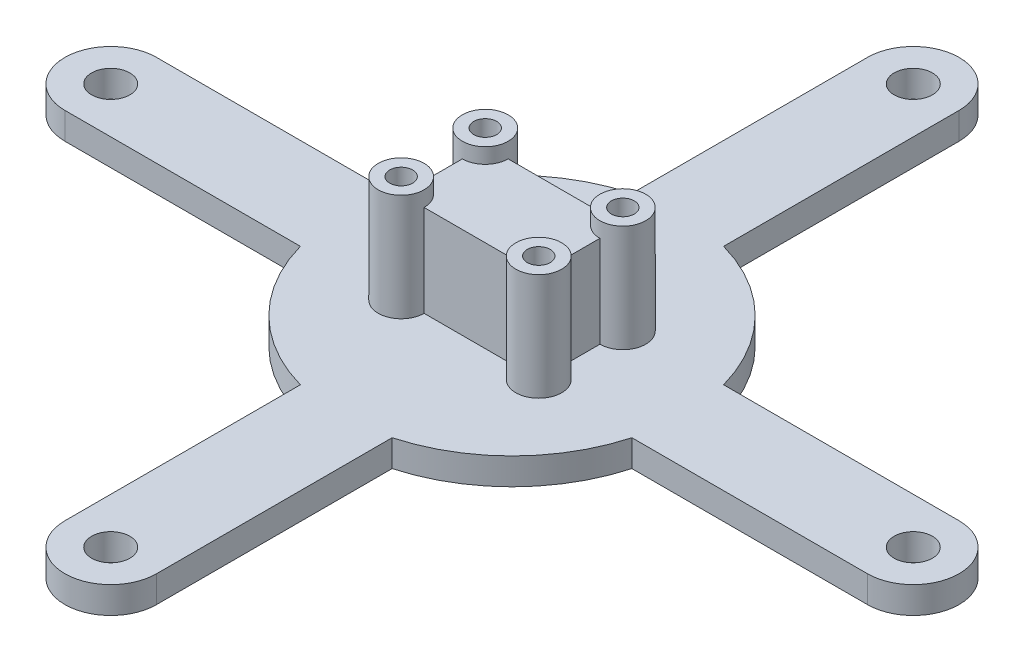
ISO-10303-21;
HEADER;
FILE_DESCRIPTION(('STEP AP214'),'2;1');
FILE_NAME('part.step','',(''),(''),'','','');
FILE_SCHEMA(('AUTOMOTIVE_DESIGN { 1 0 10303 214 1 1 1 1 }'));
ENDSEC;
DATA;
#1=APPLICATION_CONTEXT('core data for automotive mechanical design processes');
#2=APPLICATION_PROTOCOL_DEFINITION('international standard','automotive_design',2000,#1);
#3=PRODUCT_CONTEXT('',#1,'mechanical');
#4=PRODUCT('Part','Part','',(#3));
#5=PRODUCT_RELATED_PRODUCT_CATEGORY('part','',(#4));
#6=PRODUCT_DEFINITION_FORMATION('','',#4);
#7=PRODUCT_DEFINITION_CONTEXT('part definition',#1,'design');
#8=PRODUCT_DEFINITION('design','',#6,#7);
#9=PRODUCT_DEFINITION_SHAPE('','',#8);
#10=(LENGTH_UNIT() NAMED_UNIT(*) SI_UNIT(.MILLI.,.METRE.));
#11=(NAMED_UNIT(*) PLANE_ANGLE_UNIT() SI_UNIT($,.RADIAN.));
#12=(NAMED_UNIT(*) SI_UNIT($,.STERADIAN.) SOLID_ANGLE_UNIT());
#13=UNCERTAINTY_MEASURE_WITH_UNIT(LENGTH_MEASURE(1.E-05),#10,'distance_accuracy_value','');
#14=(GEOMETRIC_REPRESENTATION_CONTEXT(3) GLOBAL_UNCERTAINTY_ASSIGNED_CONTEXT((#13)) GLOBAL_UNIT_ASSIGNED_CONTEXT((#10,
#11,#12)) REPRESENTATION_CONTEXT('',''));
#15=CARTESIAN_POINT('',(0.,0.,0.));
#16=DIRECTION('',(0.,0.,1.));
#17=DIRECTION('',(1.,0.,0.));
#18=AXIS2_PLACEMENT_3D('',#15,#16,#17);
#19=CARTESIAN_POINT('',(9.,17.5,-5.5));
#20=DIRECTION('',(0.,1.,0.));
#21=DIRECTION('',(0.,0.,1.));
#22=AXIS2_PLACEMENT_3D('',#19,#20,#21);
#23=PLANE('',#22);
#24=CARTESIAN_POINT('',(-9.,17.5,-5.5));
#25=DIRECTION('',(0.,1.,0.));
#26=DIRECTION('',(0.,0.,1.));
#27=AXIS2_PLACEMENT_3D('',#24,#25,#26);
#28=CIRCLE('',#27,1.5);
#29=CARTESIAN_POINT('',(-9.,17.5,-4.));
#30=VERTEX_POINT('',#29);
#31=EDGE_CURVE('E448',#30,#30,#28,.T.);
#32=ORIENTED_EDGE('',*,*,#31,.F.);
#33=EDGE_LOOP('',(#32));
#34=FACE_BOUND('',#33,.T.);
#35=CARTESIAN_POINT('',(-9.,17.5,-5.5));
#36=DIRECTION('',(0.,1.,0.));
#37=DIRECTION('',(0.,0.,1.));
#38=AXIS2_PLACEMENT_3D('',#35,#36,#37);
#39=CIRCLE('',#38,3.);
#40=CARTESIAN_POINT('',(-9.,17.5,-2.5));
#41=VERTEX_POINT('',#40);
#42=EDGE_CURVE('E434',#41,#41,#39,.T.);
#43=ORIENTED_EDGE('',*,*,#42,.T.);
#44=EDGE_LOOP('',(#43));
#45=FACE_BOUND('',#44,.T.);
#46=ADVANCED_FACE('F36',(#34,#45),#23,.T.);
#47=CARTESIAN_POINT('',(9.,17.5,-5.5));
#48=DIRECTION('',(0.,1.,0.));
#49=DIRECTION('',(0.,0.,1.));
#50=AXIS2_PLACEMENT_3D('',#47,#48,#49);
#51=CIRCLE('',#50,1.5);
#52=CARTESIAN_POINT('',(9.,17.5,-4.));
#53=VERTEX_POINT('',#52);
#54=EDGE_CURVE('E496',#53,#53,#51,.T.);
#55=ORIENTED_EDGE('',*,*,#54,.F.);
#56=EDGE_LOOP('',(#55));
#57=FACE_BOUND('',#56,.T.);
#58=CARTESIAN_POINT('',(9.,17.5,-5.5));
#59=DIRECTION('',(0.,1.,0.));
#60=DIRECTION('',(0.,0.,1.));
#61=AXIS2_PLACEMENT_3D('',#58,#59,#60);
#62=CIRCLE('',#61,3.);
#63=CARTESIAN_POINT('',(9.,17.5,-2.5));
#64=VERTEX_POINT('',#63);
#65=EDGE_CURVE('E440',#64,#64,#62,.T.);
#66=ORIENTED_EDGE('',*,*,#65,.T.);
#67=EDGE_LOOP('',(#66));
#68=FACE_BOUND('',#67,.T.);
#69=ADVANCED_FACE('F403',(#57,#68),#23,.T.);
#70=CARTESIAN_POINT('',(9.,17.5,5.5));
#71=DIRECTION('',(0.,1.,0.));
#72=DIRECTION('',(0.,0.,1.));
#73=AXIS2_PLACEMENT_3D('',#70,#71,#72);
#74=CIRCLE('',#73,1.5);
#75=CARTESIAN_POINT('',(9.,17.5,7.));
#76=VERTEX_POINT('',#75);
#77=EDGE_CURVE('E499',#76,#76,#74,.T.);
#78=ORIENTED_EDGE('',*,*,#77,.F.);
#79=EDGE_LOOP('',(#78));
#80=FACE_BOUND('',#79,.T.);
#81=CARTESIAN_POINT('',(9.,17.5,5.5));
#82=DIRECTION('',(0.,1.,0.));
#83=DIRECTION('',(0.,0.,1.));
#84=AXIS2_PLACEMENT_3D('',#81,#82,#83);
#85=CIRCLE('',#84,3.);
#86=CARTESIAN_POINT('',(9.,17.5,8.5));
#87=VERTEX_POINT('',#86);
#88=EDGE_CURVE('E433',#87,#87,#85,.T.);
#89=ORIENTED_EDGE('',*,*,#88,.T.);
#90=EDGE_LOOP('',(#89));
#91=FACE_BOUND('',#90,.T.);
#92=ADVANCED_FACE('F410',(#80,#91),#23,.T.);
#93=CARTESIAN_POINT('',(-9.,17.5,5.5));
#94=DIRECTION('',(0.,1.,0.));
#95=DIRECTION('',(0.,0.,1.));
#96=AXIS2_PLACEMENT_3D('',#93,#94,#95);
#97=CIRCLE('',#96,1.5);
#98=CARTESIAN_POINT('',(-9.,17.5,7.));
#99=VERTEX_POINT('',#98);
#100=EDGE_CURVE('E428',#99,#99,#97,.T.);
#101=ORIENTED_EDGE('',*,*,#100,.F.);
#102=EDGE_LOOP('',(#101));
#103=FACE_BOUND('',#102,.T.);
#104=CARTESIAN_POINT('',(-9.,17.5,5.5));
#105=DIRECTION('',(0.,1.,0.));
#106=DIRECTION('',(0.,0.,1.));
#107=AXIS2_PLACEMENT_3D('',#104,#105,#106);
#108=CIRCLE('',#107,3.);
#109=CARTESIAN_POINT('',(-9.,17.5,8.5));
#110=VERTEX_POINT('',#109);
#111=EDGE_CURVE('E431',#110,#110,#108,.T.);
#112=ORIENTED_EDGE('',*,*,#111,.T.);
#113=EDGE_LOOP('',(#112));
#114=FACE_BOUND('',#113,.T.);
#115=ADVANCED_FACE('F406',(#103,#114),#23,.T.);
#116=CARTESIAN_POINT('',(5.99999999999999,17.5,-5.5));
#117=DIRECTION('',(0.,0.,1.));
#118=DIRECTION('',(1.,0.,0.));
#119=AXIS2_PLACEMENT_3D('',#116,#117,#118);
#120=PLANE('',#119);
#121=DIRECTION('',(-1.,0.,0.));
#122=VECTOR('',#121,1.);
#123=CARTESIAN_POINT('',(0.,15.5,-5.5));
#124=LINE('',#123,#122);
#125=CARTESIAN_POINT('',(5.99999999999999,15.5,-5.5));
#126=VERTEX_POINT('',#125);
#127=CARTESIAN_POINT('',(-6.,15.5,-5.5));
#128=VERTEX_POINT('',#127);
#129=EDGE_CURVE('E206',#126,#128,#124,.T.);
#130=ORIENTED_EDGE('',*,*,#129,.F.);
#131=DIRECTION('',(0.,-1.,0.));
#132=VECTOR('',#131,1.);
#133=CARTESIAN_POINT('',(5.99999999999999,17.5,-5.5));
#134=LINE('',#133,#132);
#135=CARTESIAN_POINT('',(5.99999999999999,3.5,-5.5));
#136=VERTEX_POINT('',#135);
#137=EDGE_CURVE('E226',#126,#136,#134,.T.);
#138=ORIENTED_EDGE('',*,*,#137,.T.);
#139=DIRECTION('',(-1.,0.,0.));
#140=VECTOR('',#139,1.);
#141=CARTESIAN_POINT('',(5.99999999999999,3.5,-5.5));
#142=LINE('',#141,#140);
#143=CARTESIAN_POINT('',(-6.,3.5,-5.5));
#144=VERTEX_POINT('',#143);
#145=EDGE_CURVE('E447',#136,#144,#142,.T.);
#146=ORIENTED_EDGE('',*,*,#145,.T.);
#147=DIRECTION('',(0.,-1.,0.));
#148=VECTOR('',#147,1.);
#149=CARTESIAN_POINT('',(-6.,17.5,-5.5));
#150=LINE('',#149,#148);
#151=EDGE_CURVE('E224',#128,#144,#150,.T.);
#152=ORIENTED_EDGE('',*,*,#151,.F.);
#153=EDGE_LOOP('',(#130,#138,#146,#152));
#154=FACE_BOUND('',#153,.T.);
#155=ADVANCED_FACE('F416',(#154),#120,.F.);
#156=CARTESIAN_POINT('',(-9.,17.5,-2.5));
#157=DIRECTION('',(1.,0.,0.));
#158=DIRECTION('',(0.,0.,-1.));
#159=AXIS2_PLACEMENT_3D('',#156,#157,#158);
#160=PLANE('',#159);
#161=DIRECTION('',(0.,0.,1.));
#162=VECTOR('',#161,1.);
#163=CARTESIAN_POINT('',(-9.,15.5,0.));
#164=LINE('',#163,#162);
#165=CARTESIAN_POINT('',(-9.,15.5,-2.5));
#166=VERTEX_POINT('',#165);
#167=CARTESIAN_POINT('',(-9.,15.5,2.5));
#168=VERTEX_POINT('',#167);
#169=EDGE_CURVE('E203',#166,#168,#164,.T.);
#170=ORIENTED_EDGE('',*,*,#169,.F.);
#171=DIRECTION('',(0.,-1.,0.));
#172=VECTOR('',#171,1.);
#173=CARTESIAN_POINT('',(-9.,17.5,-2.5));
#174=LINE('',#173,#172);
#175=CARTESIAN_POINT('',(-9.,3.5,-2.5));
#176=VERTEX_POINT('',#175);
#177=EDGE_CURVE('E214',#166,#176,#174,.T.);
#178=ORIENTED_EDGE('',*,*,#177,.T.);
#179=DIRECTION('',(0.,0.,1.));
#180=VECTOR('',#179,1.);
#181=CARTESIAN_POINT('',(-9.,3.5,-2.5));
#182=LINE('',#181,#180);
#183=CARTESIAN_POINT('',(-9.,3.5,2.5));
#184=VERTEX_POINT('',#183);
#185=EDGE_CURVE('E452',#176,#184,#182,.T.);
#186=ORIENTED_EDGE('',*,*,#185,.T.);
#187=DIRECTION('',(0.,-1.,0.));
#188=VECTOR('',#187,1.);
#189=CARTESIAN_POINT('',(-9.,17.5,2.5));
#190=LINE('',#189,#188);
#191=EDGE_CURVE('E216',#168,#184,#190,.T.);
#192=ORIENTED_EDGE('',*,*,#191,.F.);
#193=EDGE_LOOP('',(#170,#178,#186,#192));
#194=FACE_BOUND('',#193,.T.);
#195=ADVANCED_FACE('F212',(#194),#160,.F.);
#196=CARTESIAN_POINT('',(-6.,17.5,5.5));
#197=DIRECTION('',(0.,0.,-1.));
#198=DIRECTION('',(-1.,0.,0.));
#199=AXIS2_PLACEMENT_3D('',#196,#197,#198);
#200=PLANE('',#199);
#201=DIRECTION('',(1.,0.,0.));
#202=VECTOR('',#201,1.);
#203=CARTESIAN_POINT('',(0.,15.5,5.5));
#204=LINE('',#203,#202);
#205=CARTESIAN_POINT('',(-6.,15.5,5.5));
#206=VERTEX_POINT('',#205);
#207=CARTESIAN_POINT('',(6.,15.5,5.5));
#208=VERTEX_POINT('',#207);
#209=EDGE_CURVE('E474',#206,#208,#204,.T.);
#210=ORIENTED_EDGE('',*,*,#209,.F.);
#211=DIRECTION('',(0.,-1.,0.));
#212=VECTOR('',#211,1.);
#213=CARTESIAN_POINT('',(-6.,17.5,5.5));
#214=LINE('',#213,#212);
#215=CARTESIAN_POINT('',(-6.,3.5,5.5));
#216=VERTEX_POINT('',#215);
#217=EDGE_CURVE('E228',#206,#216,#214,.T.);
#218=ORIENTED_EDGE('',*,*,#217,.T.);
#219=DIRECTION('',(1.,0.,0.));
#220=VECTOR('',#219,1.);
#221=CARTESIAN_POINT('',(-6.,3.5,5.5));
#222=LINE('',#221,#220);
#223=CARTESIAN_POINT('',(6.,3.5,5.5));
#224=VERTEX_POINT('',#223);
#225=EDGE_CURVE('E457',#216,#224,#222,.T.);
#226=ORIENTED_EDGE('',*,*,#225,.T.);
#227=DIRECTION('',(0.,-1.,0.));
#228=VECTOR('',#227,1.);
#229=CARTESIAN_POINT('',(6.,17.5,5.5));
#230=LINE('',#229,#228);
#231=EDGE_CURVE('E466',#208,#224,#230,.T.);
#232=ORIENTED_EDGE('',*,*,#231,.F.);
#233=EDGE_LOOP('',(#210,#218,#226,#232));
#234=FACE_BOUND('',#233,.T.);
#235=ADVANCED_FACE('F470',(#234),#200,.F.);
#236=CARTESIAN_POINT('',(9.,17.5,2.5));
#237=DIRECTION('',(-1.,0.,0.));
#238=DIRECTION('',(0.,0.,1.));
#239=AXIS2_PLACEMENT_3D('',#236,#237,#238);
#240=PLANE('',#239);
#241=DIRECTION('',(0.,0.,-1.));
#242=VECTOR('',#241,1.);
#243=CARTESIAN_POINT('',(9.,15.5,0.));
#244=LINE('',#243,#242);
#245=CARTESIAN_POINT('',(9.,15.5,2.5));
#246=VERTEX_POINT('',#245);
#247=CARTESIAN_POINT('',(9.,15.5,-2.5));
#248=VERTEX_POINT('',#247);
#249=EDGE_CURVE('E486',#246,#248,#244,.T.);
#250=ORIENTED_EDGE('',*,*,#249,.F.);
#251=DIRECTION('',(0.,-1.,0.));
#252=VECTOR('',#251,1.);
#253=CARTESIAN_POINT('',(9.,17.5,2.5));
#254=LINE('',#253,#252);
#255=CARTESIAN_POINT('',(9.,3.5,2.5));
#256=VERTEX_POINT('',#255);
#257=EDGE_CURVE('E60',#246,#256,#254,.T.);
#258=ORIENTED_EDGE('',*,*,#257,.T.);
#259=DIRECTION('',(0.,0.,-1.));
#260=VECTOR('',#259,1.);
#261=CARTESIAN_POINT('',(9.,3.5,2.5));
#262=LINE('',#261,#260);
#263=CARTESIAN_POINT('',(9.,3.5,-2.5));
#264=VERTEX_POINT('',#263);
#265=EDGE_CURVE('E462',#256,#264,#262,.T.);
#266=ORIENTED_EDGE('',*,*,#265,.T.);
#267=DIRECTION('',(0.,-1.,0.));
#268=VECTOR('',#267,1.);
#269=CARTESIAN_POINT('',(9.,17.5,-2.5));
#270=LINE('',#269,#268);
#271=EDGE_CURVE('E437',#248,#264,#270,.T.);
#272=ORIENTED_EDGE('',*,*,#271,.F.);
#273=EDGE_LOOP('',(#250,#258,#266,#272));
#274=FACE_BOUND('',#273,.T.);
#275=ADVANCED_FACE('F597',(#274),#240,.F.);
#276=CARTESIAN_POINT('',(0.,3.5,6.));
#277=DIRECTION('',(0.,0.,-1.));
#278=DIRECTION('',(-1.,0.,0.));
#279=AXIS2_PLACEMENT_3D('',#276,#277,#278);
#280=PLANE('',#279);
#281=DIRECTION('',(1.,0.,0.));
#282=VECTOR('',#281,1.);
#283=CARTESIAN_POINT('',(0.,0.,6.));
#284=LINE('',#283,#282);
#285=CARTESIAN_POINT('',(21.6852484422014,0.,6.));
#286=VERTEX_POINT('',#285);
#287=CARTESIAN_POINT('',(52.5000000000013,0.,6.));
#288=VERTEX_POINT('',#287);
#289=EDGE_CURVE('E233',#286,#288,#284,.T.);
#290=ORIENTED_EDGE('',*,*,#289,.T.);
#291=DIRECTION('',(0.,-1.,0.));
#292=VECTOR('',#291,1.);
#293=CARTESIAN_POINT('',(52.5000000000013,3.5,6.));
#294=LINE('',#293,#292);
#295=CARTESIAN_POINT('',(52.5000000000013,3.5,6.));
#296=VERTEX_POINT('',#295);
#297=EDGE_CURVE('E12',#296,#288,#294,.T.);
#298=ORIENTED_EDGE('',*,*,#297,.F.);
#299=DIRECTION('',(1.,0.,0.));
#300=VECTOR('',#299,1.);
#301=CARTESIAN_POINT('',(0.,3.5,6.));
#302=LINE('',#301,#300);
#303=CARTESIAN_POINT('',(21.6852484422014,3.5,6.));
#304=VERTEX_POINT('',#303);
#305=EDGE_CURVE('E234',#304,#296,#302,.T.);
#306=ORIENTED_EDGE('',*,*,#305,.F.);
#307=DIRECTION('',(0.,-1.,0.));
#308=VECTOR('',#307,1.);
#309=CARTESIAN_POINT('',(21.6852484422014,3.5,6.));
#310=LINE('',#309,#308);
#311=EDGE_CURVE('E284',#304,#286,#310,.T.);
#312=ORIENTED_EDGE('',*,*,#311,.T.);
#313=EDGE_LOOP('',(#290,#298,#306,#312));
#314=FACE_BOUND('',#313,.T.);
#315=ADVANCED_FACE('F38',(#314),#280,.F.);
#316=CARTESIAN_POINT('',(52.5000000000013,3.5,0.));
#317=DIRECTION('',(0.,-1.,0.));
#318=DIRECTION('',(0.,0.,-1.));
#319=AXIS2_PLACEMENT_3D('',#316,#317,#318);
#320=CYLINDRICAL_SURFACE('',#319,6.00000000000124);
#321=CARTESIAN_POINT('',(52.5000000000013,0.,0.));
#322=DIRECTION('',(0.,1.,0.));
#323=DIRECTION('',(0.,0.,1.));
#324=AXIS2_PLACEMENT_3D('',#321,#322,#323);
#325=CIRCLE('',#324,6.00000000000124);
#326=CARTESIAN_POINT('',(52.5000000000013,0.,-6.));
#327=VERTEX_POINT('',#326);
#328=EDGE_CURVE('E287',#288,#327,#325,.T.);
#329=ORIENTED_EDGE('',*,*,#328,.T.);
#330=DIRECTION('',(0.,-1.,0.));
#331=VECTOR('',#330,1.);
#332=CARTESIAN_POINT('',(52.5000000000013,3.5,-6.));
#333=LINE('',#332,#331);
#334=CARTESIAN_POINT('',(52.5000000000013,3.5,-6.));
#335=VERTEX_POINT('',#334);
#336=EDGE_CURVE('E45',#335,#327,#333,.T.);
#337=ORIENTED_EDGE('',*,*,#336,.F.);
#338=CARTESIAN_POINT('',(52.5000000000013,3.5,0.));
#339=DIRECTION('',(0.,1.,0.));
#340=DIRECTION('',(0.,0.,1.));
#341=AXIS2_PLACEMENT_3D('',#338,#339,#340);
#342=CIRCLE('',#341,6.00000000000124);
#343=EDGE_CURVE('E237',#296,#335,#342,.T.);
#344=ORIENTED_EDGE('',*,*,#343,.F.);
#345=ORIENTED_EDGE('',*,*,#297,.T.);
#346=EDGE_LOOP('',(#329,#337,#344,#345));
#347=FACE_BOUND('',#346,.T.);
#348=ADVANCED_FACE('F590',(#347),#320,.T.);
#349=CARTESIAN_POINT('',(0.,3.5,-6.));
#350=DIRECTION('',(0.,0.,-1.));
#351=DIRECTION('',(-1.,0.,0.));
#352=AXIS2_PLACEMENT_3D('',#349,#350,#351);
#353=PLANE('',#352);
#354=DIRECTION('',(1.,0.,0.));
#355=VECTOR('',#354,1.);
#356=CARTESIAN_POINT('',(0.,0.,-6.));
#357=LINE('',#356,#355);
#358=CARTESIAN_POINT('',(21.6852484422014,0.,-6.));
#359=VERTEX_POINT('',#358);
#360=EDGE_CURVE('E290',#359,#327,#357,.T.);
#361=ORIENTED_EDGE('',*,*,#360,.F.);
#362=DIRECTION('',(0.,-1.,0.));
#363=VECTOR('',#362,1.);
#364=CARTESIAN_POINT('',(21.6852484422014,3.5,-6.));
#365=LINE('',#364,#363);
#366=CARTESIAN_POINT('',(21.6852484422014,3.5,-6.));
#367=VERTEX_POINT('',#366);
#368=EDGE_CURVE('E368',#367,#359,#365,.T.);
#369=ORIENTED_EDGE('',*,*,#368,.F.);
#370=DIRECTION('',(1.,0.,0.));
#371=VECTOR('',#370,1.);
#372=CARTESIAN_POINT('',(0.,3.5,-6.));
#373=LINE('',#372,#371);
#374=EDGE_CURVE('E240',#367,#335,#373,.T.);
#375=ORIENTED_EDGE('',*,*,#374,.T.);
#376=ORIENTED_EDGE('',*,*,#336,.T.);
#377=EDGE_LOOP('',(#361,#369,#375,#376));
#378=FACE_BOUND('',#377,.T.);
#379=ADVANCED_FACE('F587',(#378),#353,.T.);
#380=CARTESIAN_POINT('',(0.,3.5,0.));
#381=DIRECTION('',(0.,-1.,0.));
#382=DIRECTION('',(0.,0.,-1.));
#383=AXIS2_PLACEMENT_3D('',#380,#381,#382);
#384=CYLINDRICAL_SURFACE('',#383,22.5);
#385=CARTESIAN_POINT('',(0.,0.,0.));
#386=DIRECTION('',(0.,1.,0.));
#387=DIRECTION('',(0.,0.,1.));
#388=AXIS2_PLACEMENT_3D('',#385,#386,#387);
#389=CIRCLE('',#388,22.5);
#390=CARTESIAN_POINT('',(6.00000000000052,0.,-21.6852484422013));
#391=VERTEX_POINT('',#390);
#392=EDGE_CURVE('E293',#359,#391,#389,.T.);
#393=ORIENTED_EDGE('',*,*,#392,.T.);
#394=DIRECTION('',(0.,-1.,0.));
#395=VECTOR('',#394,1.);
#396=CARTESIAN_POINT('',(6.00000000000052,3.5,-21.6852484422013));
#397=LINE('',#396,#395);
#398=CARTESIAN_POINT('',(6.00000000000052,3.5,-21.6852484422013));
#399=VERTEX_POINT('',#398);
#400=EDGE_CURVE('E366',#399,#391,#397,.T.);
#401=ORIENTED_EDGE('',*,*,#400,.F.);
#402=CARTESIAN_POINT('',(0.,3.5,0.));
#403=DIRECTION('',(0.,1.,0.));
#404=DIRECTION('',(0.,0.,1.));
#405=AXIS2_PLACEMENT_3D('',#402,#403,#404);
#406=CIRCLE('',#405,22.5);
#407=EDGE_CURVE('E243',#367,#399,#406,.T.);
#408=ORIENTED_EDGE('',*,*,#407,.F.);
#409=ORIENTED_EDGE('',*,*,#368,.T.);
#410=EDGE_LOOP('',(#393,#401,#408,#409));
#411=FACE_BOUND('',#410,.T.);
#412=ADVANCED_FACE('F583',(#411),#384,.T.);
#413=CARTESIAN_POINT('',(6.00000000000075,3.5,0.));
#414=DIRECTION('',(1.,0.,0.));
#415=DIRECTION('',(0.,0.,-1.));
#416=AXIS2_PLACEMENT_3D('',#413,#414,#415);
#417=PLANE('',#416);
#418=DIRECTION('',(0.,0.,1.));
#419=VECTOR('',#418,1.);
#420=CARTESIAN_POINT('',(6.00000000000075,0.,0.));
#421=LINE('',#420,#419);
#422=CARTESIAN_POINT('',(6.00000000000018,0.,-52.5));
#423=VERTEX_POINT('',#422);
#424=EDGE_CURVE('E296',#423,#391,#421,.T.);
#425=ORIENTED_EDGE('',*,*,#424,.F.);
#426=DIRECTION('',(0.,-1.,0.));
#427=VECTOR('',#426,1.);
#428=CARTESIAN_POINT('',(6.00000000000018,3.5,-52.5));
#429=LINE('',#428,#427);
#430=CARTESIAN_POINT('',(6.00000000000018,3.5,-52.5));
#431=VERTEX_POINT('',#430);
#432=EDGE_CURVE('E364',#431,#423,#429,.T.);
#433=ORIENTED_EDGE('',*,*,#432,.F.);
#434=DIRECTION('',(0.,0.,1.));
#435=VECTOR('',#434,1.);
#436=CARTESIAN_POINT('',(6.00000000000075,3.5,0.));
#437=LINE('',#436,#435);
#438=EDGE_CURVE('E245',#431,#399,#437,.T.);
#439=ORIENTED_EDGE('',*,*,#438,.T.);
#440=ORIENTED_EDGE('',*,*,#400,.T.);
#441=EDGE_LOOP('',(#425,#433,#439,#440));
#442=FACE_BOUND('',#441,.T.);
#443=ADVANCED_FACE('F579',(#442),#417,.T.);
#444=CARTESIAN_POINT('',(1.83302770289264E-13,3.5,-52.5));
#445=DIRECTION('',(0.,-1.,0.));
#446=DIRECTION('',(0.,0.,-1.));
#447=AXIS2_PLACEMENT_3D('',#444,#445,#446);
#448=CYLINDRICAL_SURFACE('',#447,5.99999999999993);
#449=CARTESIAN_POINT('',(1.83302770289264E-13,0.,-52.5));
#450=DIRECTION('',(0.,1.,0.));
#451=DIRECTION('',(0.,0.,1.));
#452=AXIS2_PLACEMENT_3D('',#449,#450,#451);
#453=CIRCLE('',#452,5.99999999999993);
#454=CARTESIAN_POINT('',(-5.99999999999981,0.,-52.5));
#455=VERTEX_POINT('',#454);
#456=EDGE_CURVE('E299',#423,#455,#453,.T.);
#457=ORIENTED_EDGE('',*,*,#456,.T.);
#458=DIRECTION('',(0.,-1.,0.));
#459=VECTOR('',#458,1.);
#460=CARTESIAN_POINT('',(-5.99999999999981,3.5,-52.5));
#461=LINE('',#460,#459);
#462=CARTESIAN_POINT('',(-5.99999999999981,3.5,-52.5));
#463=VERTEX_POINT('',#462);
#464=EDGE_CURVE('E361',#463,#455,#461,.T.);
#465=ORIENTED_EDGE('',*,*,#464,.F.);
#466=CARTESIAN_POINT('',(1.83302770289264E-13,3.5,-52.5));
#467=DIRECTION('',(0.,1.,0.));
#468=DIRECTION('',(0.,0.,1.));
#469=AXIS2_PLACEMENT_3D('',#466,#467,#468);
#470=CIRCLE('',#469,5.99999999999993);
#471=EDGE_CURVE('E248',#431,#463,#470,.T.);
#472=ORIENTED_EDGE('',*,*,#471,.F.);
#473=ORIENTED_EDGE('',*,*,#432,.T.);
#474=EDGE_LOOP('',(#457,#465,#472,#473));
#475=FACE_BOUND('',#474,.T.);
#476=ADVANCED_FACE('F575',(#475),#448,.T.);
#477=CARTESIAN_POINT('',(-5.99999999999925,3.5,0.));
#478=DIRECTION('',(1.,0.,0.));
#479=DIRECTION('',(0.,0.,-1.));
#480=AXIS2_PLACEMENT_3D('',#477,#478,#479);
#481=PLANE('',#480);
#482=DIRECTION('',(0.,0.,1.));
#483=VECTOR('',#482,1.);
#484=CARTESIAN_POINT('',(-5.99999999999925,0.,0.));
#485=LINE('',#484,#483);
#486=CARTESIAN_POINT('',(-5.99999999999948,0.,-21.6852484422016));
#487=VERTEX_POINT('',#486);
#488=EDGE_CURVE('E301',#455,#487,#485,.T.);
#489=ORIENTED_EDGE('',*,*,#488,.T.);
#490=DIRECTION('',(0.,-1.,0.));
#491=VECTOR('',#490,1.);
#492=CARTESIAN_POINT('',(-5.99999999999948,3.5,-21.6852484422016));
#493=LINE('',#492,#491);
#494=CARTESIAN_POINT('',(-5.99999999999948,3.5,-21.6852484422016));
#495=VERTEX_POINT('',#494);
#496=EDGE_CURVE('E358',#495,#487,#493,.T.);
#497=ORIENTED_EDGE('',*,*,#496,.F.);
#498=DIRECTION('',(0.,0.,1.));
#499=VECTOR('',#498,1.);
#500=CARTESIAN_POINT('',(-5.99999999999925,3.5,0.));
#501=LINE('',#500,#499);
#502=EDGE_CURVE('E250',#463,#495,#501,.T.);
#503=ORIENTED_EDGE('',*,*,#502,.F.);
#504=ORIENTED_EDGE('',*,*,#464,.T.);
#505=EDGE_LOOP('',(#489,#497,#503,#504));
#506=FACE_BOUND('',#505,.T.);
#507=ADVANCED_FACE('F571',(#506),#481,.F.);
#508=CARTESIAN_POINT('',(0.,3.5,0.));
#509=DIRECTION('',(0.,-1.,0.));
#510=DIRECTION('',(0.,0.,-1.));
#511=AXIS2_PLACEMENT_3D('',#508,#509,#510);
#512=CYLINDRICAL_SURFACE('',#511,22.5);
#513=CARTESIAN_POINT('',(0.,0.,0.));
#514=DIRECTION('',(0.,1.,0.));
#515=DIRECTION('',(0.,0.,1.));
#516=AXIS2_PLACEMENT_3D('',#513,#514,#515);
#517=CIRCLE('',#516,22.5);
#518=CARTESIAN_POINT('',(-21.6852484422014,0.,-6.));
#519=VERTEX_POINT('',#518);
#520=EDGE_CURVE('E303',#487,#519,#517,.T.);
#521=ORIENTED_EDGE('',*,*,#520,.T.);
#522=DIRECTION('',(0.,-1.,0.));
#523=VECTOR('',#522,1.);
#524=CARTESIAN_POINT('',(-21.6852484422014,3.5,-6.));
#525=LINE('',#524,#523);
#526=CARTESIAN_POINT('',(-21.6852484422014,3.5,-6.));
#527=VERTEX_POINT('',#526);
#528=EDGE_CURVE('E356',#527,#519,#525,.T.);
#529=ORIENTED_EDGE('',*,*,#528,.F.);
#530=CARTESIAN_POINT('',(0.,3.5,0.));
#531=DIRECTION('',(0.,1.,0.));
#532=DIRECTION('',(0.,0.,1.));
#533=AXIS2_PLACEMENT_3D('',#530,#531,#532);
#534=CIRCLE('',#533,22.5);
#535=EDGE_CURVE('E252',#495,#527,#534,.T.);
#536=ORIENTED_EDGE('',*,*,#535,.F.);
#537=ORIENTED_EDGE('',*,*,#496,.T.);
#538=EDGE_LOOP('',(#521,#529,#536,#537));
#539=FACE_BOUND('',#538,.T.);
#540=ADVANCED_FACE('F567',(#539),#512,.T.);
#541=CARTESIAN_POINT('',(0.,3.5,-6.));
#542=DIRECTION('',(0.,0.,-1.));
#543=DIRECTION('',(-1.,0.,0.));
#544=AXIS2_PLACEMENT_3D('',#541,#542,#543);
#545=PLANE('',#544);
#546=DIRECTION('',(1.,0.,0.));
#547=VECTOR('',#546,1.);
#548=CARTESIAN_POINT('',(0.,0.,-6.));
#549=LINE('',#548,#547);
#550=CARTESIAN_POINT('',(-52.5,0.,-5.99999999999999));
#551=VERTEX_POINT('',#550);
#552=EDGE_CURVE('E306',#551,#519,#549,.T.);
#553=ORIENTED_EDGE('',*,*,#552,.F.);
#554=DIRECTION('',(0.,-1.,0.));
#555=VECTOR('',#554,1.);
#556=CARTESIAN_POINT('',(-52.5,3.5,-5.99999999999999));
#557=LINE('',#556,#555);
#558=CARTESIAN_POINT('',(-52.5,3.5,-5.99999999999999));
#559=VERTEX_POINT('',#558);
#560=EDGE_CURVE('E354',#559,#551,#557,.T.);
#561=ORIENTED_EDGE('',*,*,#560,.F.);
#562=DIRECTION('',(1.,0.,0.));
#563=VECTOR('',#562,1.);
#564=CARTESIAN_POINT('',(0.,3.5,-6.));
#565=LINE('',#564,#563);
#566=EDGE_CURVE('E254',#559,#527,#565,.T.);
#567=ORIENTED_EDGE('',*,*,#566,.T.);
#568=ORIENTED_EDGE('',*,*,#528,.T.);
#569=EDGE_LOOP('',(#553,#561,#567,#568));
#570=FACE_BOUND('',#569,.T.);
#571=ADVANCED_FACE('F563',(#570),#545,.T.);
#572=CARTESIAN_POINT('',(-52.5,3.5,0.));
#573=DIRECTION('',(0.,-1.,0.));
#574=DIRECTION('',(0.,0.,-1.));
#575=AXIS2_PLACEMENT_3D('',#572,#573,#574);
#576=CYLINDRICAL_SURFACE('',#575,5.99999999999993);
#577=CARTESIAN_POINT('',(-52.5,0.,0.));
#578=DIRECTION('',(0.,1.,0.));
#579=DIRECTION('',(0.,0.,1.));
#580=AXIS2_PLACEMENT_3D('',#577,#578,#579);
#581=CIRCLE('',#580,5.99999999999993);
#582=CARTESIAN_POINT('',(-52.5,0.,5.99999999999999));
#583=VERTEX_POINT('',#582);
#584=EDGE_CURVE('E309',#551,#583,#581,.T.);
#585=ORIENTED_EDGE('',*,*,#584,.T.);
#586=DIRECTION('',(0.,-1.,0.));
#587=VECTOR('',#586,1.);
#588=CARTESIAN_POINT('',(-52.5,3.5,5.99999999999999));
#589=LINE('',#588,#587);
#590=CARTESIAN_POINT('',(-52.5,3.5,5.99999999999999));
#591=VERTEX_POINT('',#590);
#592=EDGE_CURVE('E351',#591,#583,#589,.T.);
#593=ORIENTED_EDGE('',*,*,#592,.F.);
#594=CARTESIAN_POINT('',(-52.5,3.5,0.));
#595=DIRECTION('',(0.,1.,0.));
#596=DIRECTION('',(0.,0.,1.));
#597=AXIS2_PLACEMENT_3D('',#594,#595,#596);
#598=CIRCLE('',#597,5.99999999999993);
#599=EDGE_CURVE('E257',#559,#591,#598,.T.);
#600=ORIENTED_EDGE('',*,*,#599,.F.);
#601=ORIENTED_EDGE('',*,*,#560,.T.);
#602=EDGE_LOOP('',(#585,#593,#600,#601));
#603=FACE_BOUND('',#602,.T.);
#604=ADVANCED_FACE('F559',(#603),#576,.T.);
#605=CARTESIAN_POINT('',(0.,3.5,6.));
#606=DIRECTION('',(0.,0.,-1.));
#607=DIRECTION('',(-1.,0.,0.));
#608=AXIS2_PLACEMENT_3D('',#605,#606,#607);
#609=PLANE('',#608);
#610=DIRECTION('',(1.,0.,0.));
#611=VECTOR('',#610,1.);
#612=CARTESIAN_POINT('',(0.,0.,6.));
#613=LINE('',#612,#611);
#614=CARTESIAN_POINT('',(-21.6852484422014,0.,6.));
#615=VERTEX_POINT('',#614);
#616=EDGE_CURVE('E311',#583,#615,#613,.T.);
#617=ORIENTED_EDGE('',*,*,#616,.T.);
#618=DIRECTION('',(0.,-1.,0.));
#619=VECTOR('',#618,1.);
#620=CARTESIAN_POINT('',(-21.6852484422014,3.5,6.));
#621=LINE('',#620,#619);
#622=CARTESIAN_POINT('',(-21.6852484422014,3.5,6.));
#623=VERTEX_POINT('',#622);
#624=EDGE_CURVE('E348',#623,#615,#621,.T.);
#625=ORIENTED_EDGE('',*,*,#624,.F.);
#626=DIRECTION('',(1.,0.,0.));
#627=VECTOR('',#626,1.);
#628=CARTESIAN_POINT('',(0.,3.5,6.));
#629=LINE('',#628,#627);
#630=EDGE_CURVE('E259',#591,#623,#629,.T.);
#631=ORIENTED_EDGE('',*,*,#630,.F.);
#632=ORIENTED_EDGE('',*,*,#592,.T.);
#633=EDGE_LOOP('',(#617,#625,#631,#632));
#634=FACE_BOUND('',#633,.T.);
#635=ADVANCED_FACE('F555',(#634),#609,.F.);
#636=CARTESIAN_POINT('',(0.,3.5,0.));
#637=DIRECTION('',(0.,-1.,0.));
#638=DIRECTION('',(0.,0.,-1.));
#639=AXIS2_PLACEMENT_3D('',#636,#637,#638);
#640=CYLINDRICAL_SURFACE('',#639,22.5);
#641=CARTESIAN_POINT('',(0.,0.,0.));
#642=DIRECTION('',(0.,1.,0.));
#643=DIRECTION('',(0.,0.,1.));
#644=AXIS2_PLACEMENT_3D('',#641,#642,#643);
#645=CIRCLE('',#644,22.5);
#646=CARTESIAN_POINT('',(-5.99999999999948,0.,21.6852484422016));
#647=VERTEX_POINT('',#646);
#648=EDGE_CURVE('E313',#615,#647,#645,.T.);
#649=ORIENTED_EDGE('',*,*,#648,.T.);
#650=DIRECTION('',(0.,-1.,0.));
#651=VECTOR('',#650,1.);
#652=CARTESIAN_POINT('',(-5.99999999999948,3.5,21.6852484422016));
#653=LINE('',#652,#651);
#654=CARTESIAN_POINT('',(-5.99999999999948,3.5,21.6852484422016));
#655=VERTEX_POINT('',#654);
#656=EDGE_CURVE('E345',#655,#647,#653,.T.);
#657=ORIENTED_EDGE('',*,*,#656,.F.);
#658=CARTESIAN_POINT('',(0.,3.5,0.));
#659=DIRECTION('',(0.,1.,0.));
#660=DIRECTION('',(0.,0.,1.));
#661=AXIS2_PLACEMENT_3D('',#658,#659,#660);
#662=CIRCLE('',#661,22.5);
#663=EDGE_CURVE('E261',#623,#655,#662,.T.);
#664=ORIENTED_EDGE('',*,*,#663,.F.);
#665=ORIENTED_EDGE('',*,*,#624,.T.);
#666=EDGE_LOOP('',(#649,#657,#664,#665));
#667=FACE_BOUND('',#666,.T.);
#668=ADVANCED_FACE('F551',(#667),#640,.T.);
#669=CARTESIAN_POINT('',(-5.99999999999958,3.5,0.));
#670=DIRECTION('',(1.,0.,0.));
#671=DIRECTION('',(0.,0.,-1.));
#672=AXIS2_PLACEMENT_3D('',#669,#670,#671);
#673=PLANE('',#672);
#674=DIRECTION('',(0.,0.,1.));
#675=VECTOR('',#674,1.);
#676=CARTESIAN_POINT('',(-5.99999999999958,0.,0.));
#677=LINE('',#676,#675);
#678=CARTESIAN_POINT('',(-5.99999999999935,0.,52.5000000000006));
#679=VERTEX_POINT('',#678);
#680=EDGE_CURVE('E315',#647,#679,#677,.T.);
#681=ORIENTED_EDGE('',*,*,#680,.T.);
#682=DIRECTION('',(0.,-1.,0.));
#683=VECTOR('',#682,1.);
#684=CARTESIAN_POINT('',(-5.99999999999935,3.5,52.5000000000006));
#685=LINE('',#684,#683);
#686=CARTESIAN_POINT('',(-5.99999999999935,3.5,52.5000000000006));
#687=VERTEX_POINT('',#686);
#688=EDGE_CURVE('E342',#687,#679,#685,.T.);
#689=ORIENTED_EDGE('',*,*,#688,.F.);
#690=DIRECTION('',(0.,0.,1.));
#691=VECTOR('',#690,1.);
#692=CARTESIAN_POINT('',(-5.99999999999958,3.5,0.));
#693=LINE('',#692,#691);
#694=EDGE_CURVE('E263',#655,#687,#693,.T.);
#695=ORIENTED_EDGE('',*,*,#694,.F.);
#696=ORIENTED_EDGE('',*,*,#656,.T.);
#697=EDGE_LOOP('',(#681,#689,#695,#696));
#698=FACE_BOUND('',#697,.T.);
#699=ADVANCED_FACE('F547',(#698),#673,.F.);
#700=CARTESIAN_POINT('',(6.52256026967279E-13,3.5,52.5000000000006));
#701=DIRECTION('',(0.,-1.,0.));
#702=DIRECTION('',(0.,0.,-1.));
#703=AXIS2_PLACEMENT_3D('',#700,#701,#702);
#704=CYLINDRICAL_SURFACE('',#703,5.99999999999998);
#705=CARTESIAN_POINT('',(6.52256026967279E-13,0.,52.5000000000006));
#706=DIRECTION('',(0.,1.,0.));
#707=DIRECTION('',(0.,0.,1.));
#708=AXIS2_PLACEMENT_3D('',#705,#706,#707);
#709=CIRCLE('',#708,5.99999999999998);
#710=CARTESIAN_POINT('',(6.00000000000064,0.,52.5000000000006));
#711=VERTEX_POINT('',#710);
#712=EDGE_CURVE('E317',#679,#711,#709,.T.);
#713=ORIENTED_EDGE('',*,*,#712,.T.);
#714=DIRECTION('',(0.,-1.,0.));
#715=VECTOR('',#714,1.);
#716=CARTESIAN_POINT('',(6.00000000000064,3.5,52.5000000000006));
#717=LINE('',#716,#715);
#718=CARTESIAN_POINT('',(6.00000000000064,3.5,52.5000000000006));
#719=VERTEX_POINT('',#718);
#720=EDGE_CURVE('E340',#719,#711,#717,.T.);
#721=ORIENTED_EDGE('',*,*,#720,.F.);
#722=CARTESIAN_POINT('',(6.52256026967279E-13,3.5,52.5000000000006));
#723=DIRECTION('',(0.,1.,0.));
#724=DIRECTION('',(0.,0.,1.));
#725=AXIS2_PLACEMENT_3D('',#722,#723,#724);
#726=CIRCLE('',#725,5.99999999999998);
#727=EDGE_CURVE('E265',#687,#719,#726,.T.);
#728=ORIENTED_EDGE('',*,*,#727,.F.);
#729=ORIENTED_EDGE('',*,*,#688,.T.);
#730=EDGE_LOOP('',(#713,#721,#728,#729));
#731=FACE_BOUND('',#730,.T.);
#732=ADVANCED_FACE('F543',(#731),#704,.T.);
#733=CARTESIAN_POINT('',(6.00000000000043,3.5,0.));
#734=DIRECTION('',(1.,0.,0.));
#735=DIRECTION('',(0.,0.,-1.));
#736=AXIS2_PLACEMENT_3D('',#733,#734,#735);
#737=PLANE('',#736);
#738=DIRECTION('',(0.,0.,1.));
#739=VECTOR('',#738,1.);
#740=CARTESIAN_POINT('',(6.00000000000043,0.,0.));
#741=LINE('',#740,#739);
#742=CARTESIAN_POINT('',(6.00000000000052,0.,21.6852484422013));
#743=VERTEX_POINT('',#742);
#744=EDGE_CURVE('E320',#743,#711,#741,.T.);
#745=ORIENTED_EDGE('',*,*,#744,.F.);
#746=DIRECTION('',(0.,-1.,0.));
#747=VECTOR('',#746,1.);
#748=CARTESIAN_POINT('',(6.00000000000052,3.5,21.6852484422013));
#749=LINE('',#748,#747);
#750=CARTESIAN_POINT('',(6.00000000000052,3.5,21.6852484422013));
#751=VERTEX_POINT('',#750);
#752=EDGE_CURVE('E338',#751,#743,#749,.T.);
#753=ORIENTED_EDGE('',*,*,#752,.F.);
#754=DIRECTION('',(0.,0.,1.));
#755=VECTOR('',#754,1.);
#756=CARTESIAN_POINT('',(6.00000000000043,3.5,0.));
#757=LINE('',#756,#755);
#758=EDGE_CURVE('E267',#751,#719,#757,.T.);
#759=ORIENTED_EDGE('',*,*,#758,.T.);
#760=ORIENTED_EDGE('',*,*,#720,.T.);
#761=EDGE_LOOP('',(#745,#753,#759,#760));
#762=FACE_BOUND('',#761,.T.);
#763=ADVANCED_FACE('F529',(#762),#737,.T.);
#764=CARTESIAN_POINT('',(52.5,3.5,3.66605540578529E-13));
#765=DIRECTION('',(0.,-1.,0.));
#766=DIRECTION('',(0.,0.,-1.));
#767=AXIS2_PLACEMENT_3D('',#764,#765,#766);
#768=CYLINDRICAL_SURFACE('',#767,2.5);
#769=CARTESIAN_POINT('',(52.5,3.5,3.66605540578529E-13));
#770=DIRECTION('',(0.,1.,0.));
#771=DIRECTION('',(0.,0.,1.));
#772=AXIS2_PLACEMENT_3D('',#769,#770,#771);
#773=CIRCLE('',#772,2.5);
#774=CARTESIAN_POINT('',(52.5,3.5,2.50000000000037));
#775=VERTEX_POINT('',#774);
#776=EDGE_CURVE('E278',#775,#775,#773,.T.);
#777=ORIENTED_EDGE('',*,*,#776,.T.);
#778=EDGE_LOOP('',(#777));
#779=FACE_BOUND('',#778,.T.);
#780=CARTESIAN_POINT('',(52.5,0.,3.66605540578529E-13));
#781=DIRECTION('',(0.,1.,0.));
#782=DIRECTION('',(0.,0.,1.));
#783=AXIS2_PLACEMENT_3D('',#780,#781,#782);
#784=CIRCLE('',#783,2.5);
#785=CARTESIAN_POINT('',(52.5,0.,2.50000000000037));
#786=VERTEX_POINT('',#785);
#787=EDGE_CURVE('E331',#786,#786,#784,.T.);
#788=ORIENTED_EDGE('',*,*,#787,.F.);
#789=EDGE_LOOP('',(#788));
#790=FACE_BOUND('',#789,.T.);
#791=ADVANCED_FACE('F525',(#779,#790),#768,.F.);
#792=CARTESIAN_POINT('',(1.83302770289264E-13,3.5,-52.5));
#793=DIRECTION('',(0.,-1.,0.));
#794=DIRECTION('',(0.,0.,-1.));
#795=AXIS2_PLACEMENT_3D('',#792,#793,#794);
#796=CYLINDRICAL_SURFACE('',#795,2.5);
#797=CARTESIAN_POINT('',(1.83302770289264E-13,3.5,-52.5));
#798=DIRECTION('',(0.,1.,0.));
#799=DIRECTION('',(0.,0.,1.));
#800=AXIS2_PLACEMENT_3D('',#797,#798,#799);
#801=CIRCLE('',#800,2.5);
#802=CARTESIAN_POINT('',(1.83302770289264E-13,3.5,-50.));
#803=VERTEX_POINT('',#802);
#804=EDGE_CURVE('E275',#803,#803,#801,.T.);
#805=ORIENTED_EDGE('',*,*,#804,.T.);
#806=EDGE_LOOP('',(#805));
#807=FACE_BOUND('',#806,.T.);
#808=CARTESIAN_POINT('',(1.83302770289264E-13,0.,-52.5));
#809=DIRECTION('',(0.,1.,0.));
#810=DIRECTION('',(0.,0.,1.));
#811=AXIS2_PLACEMENT_3D('',#808,#809,#810);
#812=CIRCLE('',#811,2.5);
#813=CARTESIAN_POINT('',(1.83302770289264E-13,0.,-50.));
#814=VERTEX_POINT('',#813);
#815=EDGE_CURVE('E328',#814,#814,#812,.T.);
#816=ORIENTED_EDGE('',*,*,#815,.F.);
#817=EDGE_LOOP('',(#816));
#818=FACE_BOUND('',#817,.T.);
#819=ADVANCED_FACE('F528',(#807,#818),#796,.F.);
#820=CARTESIAN_POINT('',(-52.5,3.5,0.));
#821=DIRECTION('',(0.,-1.,0.));
#822=DIRECTION('',(0.,0.,-1.));
#823=AXIS2_PLACEMENT_3D('',#820,#821,#822);
#824=CYLINDRICAL_SURFACE('',#823,2.5);
#825=CARTESIAN_POINT('',(-52.5,3.5,0.));
#826=DIRECTION('',(0.,1.,0.));
#827=DIRECTION('',(0.,0.,1.));
#828=AXIS2_PLACEMENT_3D('',#825,#826,#827);
#829=CIRCLE('',#828,2.5);
#830=CARTESIAN_POINT('',(-52.5,3.5,2.5));
#831=VERTEX_POINT('',#830);
#832=EDGE_CURVE('E272',#831,#831,#829,.T.);
#833=ORIENTED_EDGE('',*,*,#832,.T.);
#834=EDGE_LOOP('',(#833));
#835=FACE_BOUND('',#834,.T.);
#836=CARTESIAN_POINT('',(-52.5,0.,0.));
#837=DIRECTION('',(0.,1.,0.));
#838=DIRECTION('',(0.,0.,1.));
#839=AXIS2_PLACEMENT_3D('',#836,#837,#838);
#840=CIRCLE('',#839,2.5);
#841=CARTESIAN_POINT('',(-52.5,0.,2.5));
#842=VERTEX_POINT('',#841);
#843=EDGE_CURVE('E325',#842,#842,#840,.T.);
#844=ORIENTED_EDGE('',*,*,#843,.F.);
#845=EDGE_LOOP('',(#844));
#846=FACE_BOUND('',#845,.T.);
#847=ADVANCED_FACE('F533',(#835,#846),#824,.F.);
#848=CARTESIAN_POINT('',(0.,3.5,0.));
#849=DIRECTION('',(0.,-1.,0.));
#850=DIRECTION('',(0.,0.,-1.));
#851=AXIS2_PLACEMENT_3D('',#848,#849,#850);
#852=CYLINDRICAL_SURFACE('',#851,22.5);
#853=CARTESIAN_POINT('',(0.,0.,0.));
#854=DIRECTION('',(0.,1.,0.));
#855=DIRECTION('',(0.,0.,1.));
#856=AXIS2_PLACEMENT_3D('',#853,#854,#855);
#857=CIRCLE('',#856,22.5);
#858=EDGE_CURVE('E323',#743,#286,#857,.T.);
#859=ORIENTED_EDGE('',*,*,#858,.T.);
#860=ORIENTED_EDGE('',*,*,#311,.F.);
#861=CARTESIAN_POINT('',(0.,3.5,0.));
#862=DIRECTION('',(0.,1.,0.));
#863=DIRECTION('',(0.,0.,1.));
#864=AXIS2_PLACEMENT_3D('',#861,#862,#863);
#865=CIRCLE('',#864,22.5);
#866=EDGE_CURVE('E270',#751,#304,#865,.T.);
#867=ORIENTED_EDGE('',*,*,#866,.F.);
#868=ORIENTED_EDGE('',*,*,#752,.T.);
#869=EDGE_LOOP('',(#859,#860,#867,#868));
#870=FACE_BOUND('',#869,.T.);
#871=ADVANCED_FACE('F523',(#870),#852,.T.);
#872=CARTESIAN_POINT('',(-5.49908310867793E-13,3.5,52.5));
#873=DIRECTION('',(0.,-1.,0.));
#874=DIRECTION('',(0.,0.,-1.));
#875=AXIS2_PLACEMENT_3D('',#872,#873,#874);
#876=CYLINDRICAL_SURFACE('',#875,2.5);
#877=CARTESIAN_POINT('',(-5.49908310867793E-13,3.5,52.5));
#878=DIRECTION('',(0.,1.,0.));
#879=DIRECTION('',(0.,0.,1.));
#880=AXIS2_PLACEMENT_3D('',#877,#878,#879);
#881=CIRCLE('',#880,2.5);
#882=CARTESIAN_POINT('',(-5.49908310867793E-13,3.5,55.));
#883=VERTEX_POINT('',#882);
#884=EDGE_CURVE('E281',#883,#883,#881,.T.);
#885=ORIENTED_EDGE('',*,*,#884,.T.);
#886=EDGE_LOOP('',(#885));
#887=FACE_BOUND('',#886,.T.);
#888=CARTESIAN_POINT('',(-5.49908310867793E-13,0.,52.5));
#889=DIRECTION('',(0.,1.,0.));
#890=DIRECTION('',(0.,0.,1.));
#891=AXIS2_PLACEMENT_3D('',#888,#889,#890);
#892=CIRCLE('',#891,2.5);
#893=CARTESIAN_POINT('',(-5.49908310867793E-13,0.,55.));
#894=VERTEX_POINT('',#893);
#895=EDGE_CURVE('E238',#894,#894,#892,.T.);
#896=ORIENTED_EDGE('',*,*,#895,.F.);
#897=EDGE_LOOP('',(#896));
#898=FACE_BOUND('',#897,.T.);
#899=ADVANCED_FACE('F519',(#887,#898),#876,.F.);
#900=CARTESIAN_POINT('',(0.,3.5,0.));
#901=DIRECTION('',(0.,1.,0.));
#902=DIRECTION('',(0.,0.,1.));
#903=AXIS2_PLACEMENT_3D('',#900,#901,#902);
#904=PLANE('',#903);
#905=ORIENTED_EDGE('',*,*,#145,.F.);
#906=CARTESIAN_POINT('',(9.,3.5,-5.5));
#907=DIRECTION('',(0.,1.,0.));
#908=DIRECTION('',(0.,0.,1.));
#909=AXIS2_PLACEMENT_3D('',#906,#907,#908);
#910=CIRCLE('',#909,3.);
#911=EDGE_CURVE('E444',#264,#136,#910,.T.);
#912=ORIENTED_EDGE('',*,*,#911,.F.);
#913=ORIENTED_EDGE('',*,*,#265,.F.);
#914=CARTESIAN_POINT('',(9.,3.5,5.5));
#915=DIRECTION('',(0.,1.,0.));
#916=DIRECTION('',(0.,0.,1.));
#917=AXIS2_PLACEMENT_3D('',#914,#915,#916);
#918=CIRCLE('',#917,3.);
#919=EDGE_CURVE('E460',#224,#256,#918,.T.);
#920=ORIENTED_EDGE('',*,*,#919,.F.);
#921=ORIENTED_EDGE('',*,*,#225,.F.);
#922=CARTESIAN_POINT('',(-9.,3.5,5.5));
#923=DIRECTION('',(0.,1.,0.));
#924=DIRECTION('',(0.,0.,1.));
#925=AXIS2_PLACEMENT_3D('',#922,#923,#924);
#926=CIRCLE('',#925,3.);
#927=EDGE_CURVE('E454',#184,#216,#926,.T.);
#928=ORIENTED_EDGE('',*,*,#927,.F.);
#929=ORIENTED_EDGE('',*,*,#185,.F.);
#930=CARTESIAN_POINT('',(-9.,3.5,-5.5));
#931=DIRECTION('',(0.,1.,0.));
#932=DIRECTION('',(0.,0.,1.));
#933=AXIS2_PLACEMENT_3D('',#930,#931,#932);
#934=CIRCLE('',#933,3.);
#935=EDGE_CURVE('E222',#144,#176,#934,.T.);
#936=ORIENTED_EDGE('',*,*,#935,.F.);
#937=EDGE_LOOP('',(#905,#912,#913,#920,#921,#928,#929,#936));
#938=FACE_BOUND('',#937,.T.);
#939=ORIENTED_EDGE('',*,*,#305,.T.);
#940=ORIENTED_EDGE('',*,*,#343,.T.);
#941=ORIENTED_EDGE('',*,*,#374,.F.);
#942=ORIENTED_EDGE('',*,*,#407,.T.);
#943=ORIENTED_EDGE('',*,*,#438,.F.);
#944=ORIENTED_EDGE('',*,*,#471,.T.);
#945=ORIENTED_EDGE('',*,*,#502,.T.);
#946=ORIENTED_EDGE('',*,*,#535,.T.);
#947=ORIENTED_EDGE('',*,*,#566,.F.);
#948=ORIENTED_EDGE('',*,*,#599,.T.);
#949=ORIENTED_EDGE('',*,*,#630,.T.);
#950=ORIENTED_EDGE('',*,*,#663,.T.);
#951=ORIENTED_EDGE('',*,*,#694,.T.);
#952=ORIENTED_EDGE('',*,*,#727,.T.);
#953=ORIENTED_EDGE('',*,*,#758,.F.);
#954=ORIENTED_EDGE('',*,*,#866,.T.);
#955=EDGE_LOOP('',(#939,#940,#941,#942,#943,#944,#945,#946,#947,#948,#949,#950,#951,#952,#953,#954));
#956=FACE_BOUND('',#955,.T.);
#957=ORIENTED_EDGE('',*,*,#832,.F.);
#958=EDGE_LOOP('',(#957));
#959=FACE_BOUND('',#958,.T.);
#960=ORIENTED_EDGE('',*,*,#804,.F.);
#961=EDGE_LOOP('',(#960));
#962=FACE_BOUND('',#961,.T.);
#963=ORIENTED_EDGE('',*,*,#776,.F.);
#964=EDGE_LOOP('',(#963));
#965=FACE_BOUND('',#964,.T.);
#966=ORIENTED_EDGE('',*,*,#884,.F.);
#967=EDGE_LOOP('',(#966));
#968=FACE_BOUND('',#967,.T.);
#969=ADVANCED_FACE('F480',(#938,#956,#959,#962,#965,#968),#904,.T.);
#970=CARTESIAN_POINT('',(0.,0.,0.));
#971=DIRECTION('',(0.,1.,0.));
#972=DIRECTION('',(0.,0.,1.));
#973=AXIS2_PLACEMENT_3D('',#970,#971,#972);
#974=PLANE('',#973);
#975=CARTESIAN_POINT('',(9.,0.,5.5));
#976=DIRECTION('',(0.,1.,0.));
#977=DIRECTION('',(0.,0.,1.));
#978=AXIS2_PLACEMENT_3D('',#975,#976,#977);
#979=CIRCLE('',#978,1.5);
#980=CARTESIAN_POINT('',(9.,0.,7.));
#981=VERTEX_POINT('',#980);
#982=EDGE_CURVE('E40',#981,#981,#979,.T.);
#983=ORIENTED_EDGE('',*,*,#982,.T.);
#984=EDGE_LOOP('',(#983));
#985=FACE_BOUND('',#984,.T.);
#986=CARTESIAN_POINT('',(-9.,0.,-5.5));
#987=DIRECTION('',(0.,1.,0.));
#988=DIRECTION('',(0.,0.,1.));
#989=AXIS2_PLACEMENT_3D('',#986,#987,#988);
#990=CIRCLE('',#989,1.5);
#991=CARTESIAN_POINT('',(-9.,0.,-4.));
#992=VERTEX_POINT('',#991);
#993=EDGE_CURVE('E376',#992,#992,#990,.T.);
#994=ORIENTED_EDGE('',*,*,#993,.T.);
#995=EDGE_LOOP('',(#994));
#996=FACE_BOUND('',#995,.T.);
#997=CARTESIAN_POINT('',(9.,0.,-5.5));
#998=DIRECTION('',(0.,1.,0.));
#999=DIRECTION('',(0.,0.,1.));
#1000=AXIS2_PLACEMENT_3D('',#997,#998,#999);
#1001=CIRCLE('',#1000,1.5);
#1002=CARTESIAN_POINT('',(9.,0.,-4.));
#1003=VERTEX_POINT('',#1002);
#1004=EDGE_CURVE('E374',#1003,#1003,#1001,.T.);
#1005=ORIENTED_EDGE('',*,*,#1004,.T.);
#1006=EDGE_LOOP('',(#1005));
#1007=FACE_BOUND('',#1006,.T.);
#1008=CARTESIAN_POINT('',(-9.,0.,5.5));
#1009=DIRECTION('',(0.,1.,0.));
#1010=DIRECTION('',(0.,0.,1.));
#1011=AXIS2_PLACEMENT_3D('',#1008,#1009,#1010);
#1012=CIRCLE('',#1011,1.5);
#1013=CARTESIAN_POINT('',(-9.,0.,7.));
#1014=VERTEX_POINT('',#1013);
#1015=EDGE_CURVE('E371',#1014,#1014,#1012,.T.);
#1016=ORIENTED_EDGE('',*,*,#1015,.T.);
#1017=EDGE_LOOP('',(#1016));
#1018=FACE_BOUND('',#1017,.T.);
#1019=ORIENTED_EDGE('',*,*,#289,.F.);
#1020=ORIENTED_EDGE('',*,*,#858,.F.);
#1021=ORIENTED_EDGE('',*,*,#744,.T.);
#1022=ORIENTED_EDGE('',*,*,#712,.F.);
#1023=ORIENTED_EDGE('',*,*,#680,.F.);
#1024=ORIENTED_EDGE('',*,*,#648,.F.);
#1025=ORIENTED_EDGE('',*,*,#616,.F.);
#1026=ORIENTED_EDGE('',*,*,#584,.F.);
#1027=ORIENTED_EDGE('',*,*,#552,.T.);
#1028=ORIENTED_EDGE('',*,*,#520,.F.);
#1029=ORIENTED_EDGE('',*,*,#488,.F.);
#1030=ORIENTED_EDGE('',*,*,#456,.F.);
#1031=ORIENTED_EDGE('',*,*,#424,.T.);
#1032=ORIENTED_EDGE('',*,*,#392,.F.);
#1033=ORIENTED_EDGE('',*,*,#360,.T.);
#1034=ORIENTED_EDGE('',*,*,#328,.F.);
#1035=EDGE_LOOP('',(#1019,#1020,#1021,#1022,#1023,#1024,#1025,#1026,#1027,#1028,#1029,#1030,
#1031,#1032,#1033,#1034));
#1036=FACE_BOUND('',#1035,.T.);
#1037=ORIENTED_EDGE('',*,*,#843,.T.);
#1038=EDGE_LOOP('',(#1037));
#1039=FACE_BOUND('',#1038,.T.);
#1040=ORIENTED_EDGE('',*,*,#815,.T.);
#1041=EDGE_LOOP('',(#1040));
#1042=FACE_BOUND('',#1041,.T.);
#1043=ORIENTED_EDGE('',*,*,#787,.T.);
#1044=EDGE_LOOP('',(#1043));
#1045=FACE_BOUND('',#1044,.T.);
#1046=ORIENTED_EDGE('',*,*,#895,.T.);
#1047=EDGE_LOOP('',(#1046));
#1048=FACE_BOUND('',#1047,.T.);
#1049=ADVANCED_FACE('F383',(#985,#996,#1007,#1018,#1036,#1039,#1042,#1045,#1048),#974,.F.);
#1050=CARTESIAN_POINT('',(9.,17.5,-5.5));
#1051=DIRECTION('',(0.,-1.,0.));
#1052=DIRECTION('',(0.,0.,-1.));
#1053=AXIS2_PLACEMENT_3D('',#1050,#1051,#1052);
#1054=CYLINDRICAL_SURFACE('',#1053,3.);
#1055=ORIENTED_EDGE('',*,*,#137,.F.);
#1056=CARTESIAN_POINT('',(9.,15.5,-5.5));
#1057=DIRECTION('',(0.,1.,0.));
#1058=DIRECTION('',(0.,0.,1.));
#1059=AXIS2_PLACEMENT_3D('',#1056,#1057,#1058);
#1060=CIRCLE('',#1059,3.);
#1061=EDGE_CURVE('E492',#126,#248,#1060,.T.);
#1062=ORIENTED_EDGE('',*,*,#1061,.T.);
#1063=ORIENTED_EDGE('',*,*,#271,.T.);
#1064=ORIENTED_EDGE('',*,*,#911,.T.);
#1065=EDGE_LOOP('',(#1055,#1062,#1063,#1064));
#1066=FACE_BOUND('',#1065,.T.);
#1067=ORIENTED_EDGE('',*,*,#65,.F.);
#1068=EDGE_LOOP('',(#1067));
#1069=FACE_BOUND('',#1068,.T.);
#1070=ADVANCED_FACE('F506',(#1066,#1069),#1054,.T.);
#1071=CARTESIAN_POINT('',(-9.,17.5,-5.5));
#1072=DIRECTION('',(0.,-1.,0.));
#1073=DIRECTION('',(0.,0.,-1.));
#1074=AXIS2_PLACEMENT_3D('',#1071,#1072,#1073);
#1075=CYLINDRICAL_SURFACE('',#1074,3.);
#1076=CARTESIAN_POINT('',(-9.,15.5,-5.5));
#1077=DIRECTION('',(0.,1.,0.));
#1078=DIRECTION('',(0.,0.,1.));
#1079=AXIS2_PLACEMENT_3D('',#1076,#1077,#1078);
#1080=CIRCLE('',#1079,3.);
#1081=EDGE_CURVE('E200',#166,#128,#1080,.T.);
#1082=ORIENTED_EDGE('',*,*,#1081,.T.);
#1083=ORIENTED_EDGE('',*,*,#151,.T.);
#1084=ORIENTED_EDGE('',*,*,#935,.T.);
#1085=ORIENTED_EDGE('',*,*,#177,.F.);
#1086=EDGE_LOOP('',(#1082,#1083,#1084,#1085));
#1087=FACE_BOUND('',#1086,.T.);
#1088=ORIENTED_EDGE('',*,*,#42,.F.);
#1089=EDGE_LOOP('',(#1088));
#1090=FACE_BOUND('',#1089,.T.);
#1091=ADVANCED_FACE('F219',(#1087,#1090),#1075,.T.);
#1092=CARTESIAN_POINT('',(-9.,17.5,5.5));
#1093=DIRECTION('',(0.,-1.,0.));
#1094=DIRECTION('',(0.,0.,-1.));
#1095=AXIS2_PLACEMENT_3D('',#1092,#1093,#1094);
#1096=CYLINDRICAL_SURFACE('',#1095,3.);
#1097=CARTESIAN_POINT('',(-9.,15.5,5.5));
#1098=DIRECTION('',(0.,1.,0.));
#1099=DIRECTION('',(0.,0.,1.));
#1100=AXIS2_PLACEMENT_3D('',#1097,#1098,#1099);
#1101=CIRCLE('',#1100,3.);
#1102=EDGE_CURVE('E217',#206,#168,#1101,.T.);
#1103=ORIENTED_EDGE('',*,*,#1102,.T.);
#1104=ORIENTED_EDGE('',*,*,#191,.T.);
#1105=ORIENTED_EDGE('',*,*,#927,.T.);
#1106=ORIENTED_EDGE('',*,*,#217,.F.);
#1107=EDGE_LOOP('',(#1103,#1104,#1105,#1106));
#1108=FACE_BOUND('',#1107,.T.);
#1109=ORIENTED_EDGE('',*,*,#111,.F.);
#1110=EDGE_LOOP('',(#1109));
#1111=FACE_BOUND('',#1110,.T.);
#1112=ADVANCED_FACE('F477',(#1108,#1111),#1096,.T.);
#1113=CARTESIAN_POINT('',(9.,17.5,5.5));
#1114=DIRECTION('',(0.,-1.,0.));
#1115=DIRECTION('',(0.,0.,-1.));
#1116=AXIS2_PLACEMENT_3D('',#1113,#1114,#1115);
#1117=CYLINDRICAL_SURFACE('',#1116,3.);
#1118=CARTESIAN_POINT('',(9.,15.5,5.5));
#1119=DIRECTION('',(0.,1.,0.));
#1120=DIRECTION('',(0.,0.,1.));
#1121=AXIS2_PLACEMENT_3D('',#1118,#1119,#1120);
#1122=CIRCLE('',#1121,3.);
#1123=EDGE_CURVE('E53',#246,#208,#1122,.T.);
#1124=ORIENTED_EDGE('',*,*,#1123,.T.);
#1125=ORIENTED_EDGE('',*,*,#231,.T.);
#1126=ORIENTED_EDGE('',*,*,#919,.T.);
#1127=ORIENTED_EDGE('',*,*,#257,.F.);
#1128=EDGE_LOOP('',(#1124,#1125,#1126,#1127));
#1129=FACE_BOUND('',#1128,.T.);
#1130=ORIENTED_EDGE('',*,*,#88,.F.);
#1131=EDGE_LOOP('',(#1130));
#1132=FACE_BOUND('',#1131,.T.);
#1133=ADVANCED_FACE('F398',(#1129,#1132),#1117,.T.);
#1134=CARTESIAN_POINT('',(-9.,17.5,-5.5));
#1135=DIRECTION('',(0.,-1.,0.));
#1136=DIRECTION('',(0.,0.,-1.));
#1137=AXIS2_PLACEMENT_3D('',#1134,#1135,#1136);
#1138=CYLINDRICAL_SURFACE('',#1137,1.5);
#1139=ORIENTED_EDGE('',*,*,#31,.T.);
#1140=EDGE_LOOP('',(#1139));
#1141=FACE_BOUND('',#1140,.T.);
#1142=ORIENTED_EDGE('',*,*,#993,.F.);
#1143=EDGE_LOOP('',(#1142));
#1144=FACE_BOUND('',#1143,.T.);
#1145=ADVANCED_FACE('F388',(#1141,#1144),#1138,.F.);
#1146=CARTESIAN_POINT('',(9.,17.5,5.5));
#1147=DIRECTION('',(0.,-1.,0.));
#1148=DIRECTION('',(0.,0.,-1.));
#1149=AXIS2_PLACEMENT_3D('',#1146,#1147,#1148);
#1150=CYLINDRICAL_SURFACE('',#1149,1.5);
#1151=ORIENTED_EDGE('',*,*,#77,.T.);
#1152=EDGE_LOOP('',(#1151));
#1153=FACE_BOUND('',#1152,.T.);
#1154=ORIENTED_EDGE('',*,*,#982,.F.);
#1155=EDGE_LOOP('',(#1154));
#1156=FACE_BOUND('',#1155,.T.);
#1157=ADVANCED_FACE('F385',(#1153,#1156),#1150,.F.);
#1158=CARTESIAN_POINT('',(9.,17.5,-5.5));
#1159=DIRECTION('',(0.,-1.,0.));
#1160=DIRECTION('',(0.,0.,-1.));
#1161=AXIS2_PLACEMENT_3D('',#1158,#1159,#1160);
#1162=CYLINDRICAL_SURFACE('',#1161,1.5);
#1163=ORIENTED_EDGE('',*,*,#54,.T.);
#1164=EDGE_LOOP('',(#1163));
#1165=FACE_BOUND('',#1164,.T.);
#1166=ORIENTED_EDGE('',*,*,#1004,.F.);
#1167=EDGE_LOOP('',(#1166));
#1168=FACE_BOUND('',#1167,.T.);
#1169=ADVANCED_FACE('F387',(#1165,#1168),#1162,.F.);
#1170=CARTESIAN_POINT('',(-9.,17.5,5.5));
#1171=DIRECTION('',(0.,-1.,0.));
#1172=DIRECTION('',(0.,0.,-1.));
#1173=AXIS2_PLACEMENT_3D('',#1170,#1171,#1172);
#1174=CYLINDRICAL_SURFACE('',#1173,1.5);
#1175=ORIENTED_EDGE('',*,*,#100,.T.);
#1176=EDGE_LOOP('',(#1175));
#1177=FACE_BOUND('',#1176,.T.);
#1178=ORIENTED_EDGE('',*,*,#1015,.F.);
#1179=EDGE_LOOP('',(#1178));
#1180=FACE_BOUND('',#1179,.T.);
#1181=ADVANCED_FACE('F395',(#1177,#1180),#1174,.F.);
#1182=CARTESIAN_POINT('',(0.,15.5,0.));
#1183=DIRECTION('',(0.,1.,0.));
#1184=DIRECTION('',(0.,0.,1.));
#1185=AXIS2_PLACEMENT_3D('',#1182,#1183,#1184);
#1186=PLANE('',#1185);
#1187=ORIENTED_EDGE('',*,*,#1081,.F.);
#1188=ORIENTED_EDGE('',*,*,#169,.T.);
#1189=ORIENTED_EDGE('',*,*,#1102,.F.);
#1190=ORIENTED_EDGE('',*,*,#209,.T.);
#1191=ORIENTED_EDGE('',*,*,#1123,.F.);
#1192=ORIENTED_EDGE('',*,*,#249,.T.);
#1193=ORIENTED_EDGE('',*,*,#1061,.F.);
#1194=ORIENTED_EDGE('',*,*,#129,.T.);
#1195=EDGE_LOOP('',(#1187,#1188,#1189,#1190,#1191,#1192,#1193,#1194));
#1196=FACE_BOUND('',#1195,.T.);
#1197=ADVANCED_FACE('F202',(#1196),#1186,.T.);
#1198=CLOSED_SHELL('',(#46,#69,#92,#115,#155,#195,#235,#275,#315,#348,#379,#412,#443,#476,#507,
#540,#571,#604,#635,#668,#699,#732,#763,#791,#819,#847,#871,#899,#969,#1049,#1070,#1091,#1112,
#1133,#1145,#1157,#1169,#1181,#1197));
#1199=MANIFOLD_SOLID_BREP('B2',#1198);
#1200=ADVANCED_BREP_SHAPE_REPRESENTATION('',(#18,#1199),#14);
#1201=SHAPE_DEFINITION_REPRESENTATION(#9,#1200);
ENDSEC;
END-ISO-10303-21;
